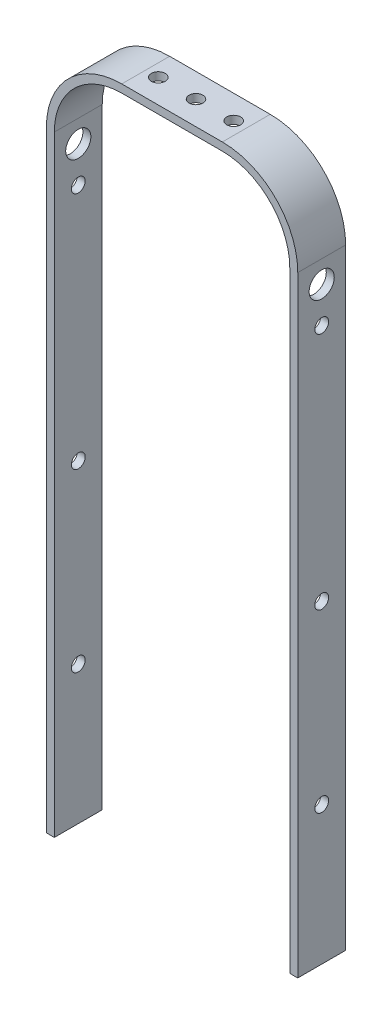
ISO-10303-21;
HEADER;
FILE_DESCRIPTION(('STEP AP214'),'2;1');
FILE_NAME('part.step','',(''),(''),'','','');
FILE_SCHEMA(('AUTOMOTIVE_DESIGN { 1 0 10303 214 1 1 1 1 }'));
ENDSEC;
DATA;
#1=APPLICATION_CONTEXT('core data for automotive mechanical design processes');
#2=APPLICATION_PROTOCOL_DEFINITION('international standard','automotive_design',2000,#1);
#3=PRODUCT_CONTEXT('',#1,'mechanical');
#4=PRODUCT('Part','Part','',(#3));
#5=PRODUCT_RELATED_PRODUCT_CATEGORY('part','',(#4));
#6=PRODUCT_DEFINITION_FORMATION('','',#4);
#7=PRODUCT_DEFINITION_CONTEXT('part definition',#1,'design');
#8=PRODUCT_DEFINITION('design','',#6,#7);
#9=PRODUCT_DEFINITION_SHAPE('','',#8);
#10=(LENGTH_UNIT() NAMED_UNIT(*) SI_UNIT(.MILLI.,.METRE.));
#11=(NAMED_UNIT(*) PLANE_ANGLE_UNIT() SI_UNIT($,.RADIAN.));
#12=(NAMED_UNIT(*) SI_UNIT($,.STERADIAN.) SOLID_ANGLE_UNIT());
#13=UNCERTAINTY_MEASURE_WITH_UNIT(LENGTH_MEASURE(1.E-05),#10,'distance_accuracy_value','');
#14=(GEOMETRIC_REPRESENTATION_CONTEXT(3) GLOBAL_UNCERTAINTY_ASSIGNED_CONTEXT((#13)) GLOBAL_UNIT_ASSIGNED_CONTEXT((#10,
#11,#12)) REPRESENTATION_CONTEXT('',''));
#15=CARTESIAN_POINT('',(0.,0.,0.));
#16=DIRECTION('',(0.,0.,1.));
#17=DIRECTION('',(1.,0.,0.));
#18=AXIS2_PLACEMENT_3D('',#15,#16,#17);
#19=CARTESIAN_POINT('',(46.825,0.,9.525));
#20=DIRECTION('',(0.,1.,0.));
#21=DIRECTION('',(-1.,0.,0.));
#22=AXIS2_PLACEMENT_3D('',#19,#20,#21);
#23=PLANE('',#22);
#24=DIRECTION('',(1.,0.,0.));
#25=VECTOR('',#24,1.);
#26=CARTESIAN_POINT('',(46.825,0.,-9.525));
#27=LINE('',#26,#25);
#28=CARTESIAN_POINT('',(46.825,0.,-9.525));
#29=VERTEX_POINT('',#28);
#30=CARTESIAN_POINT('',(50.,0.,-9.525));
#31=VERTEX_POINT('',#30);
#32=EDGE_CURVE('E157',#29,#31,#27,.T.);
#33=ORIENTED_EDGE('',*,*,#32,.T.);
#34=DIRECTION('',(0.,0.,-1.));
#35=VECTOR('',#34,1.);
#36=CARTESIAN_POINT('',(50.,0.,9.525));
#37=LINE('',#36,#35);
#38=CARTESIAN_POINT('',(50.,0.,9.525));
#39=VERTEX_POINT('',#38);
#40=EDGE_CURVE('E11',#39,#31,#37,.T.);
#41=ORIENTED_EDGE('',*,*,#40,.F.);
#42=DIRECTION('',(1.,0.,0.));
#43=VECTOR('',#42,1.);
#44=CARTESIAN_POINT('',(46.825,0.,9.525));
#45=LINE('',#44,#43);
#46=CARTESIAN_POINT('',(46.825,0.,9.525));
#47=VERTEX_POINT('',#46);
#48=EDGE_CURVE('E180',#47,#39,#45,.T.);
#49=ORIENTED_EDGE('',*,*,#48,.F.);
#50=DIRECTION('',(0.,0.,-1.));
#51=VECTOR('',#50,1.);
#52=CARTESIAN_POINT('',(46.825,0.,9.525));
#53=LINE('',#52,#51);
#54=EDGE_CURVE('E153',#47,#29,#53,.T.);
#55=ORIENTED_EDGE('',*,*,#54,.T.);
#56=EDGE_LOOP('',(#33,#41,#49,#55));
#57=FACE_BOUND('',#56,.T.);
#58=ADVANCED_FACE('F35',(#57),#23,.F.);
#59=CARTESIAN_POINT('',(50.,0.,9.525));
#60=DIRECTION('',(-1.,0.,0.));
#61=DIRECTION('',(0.,0.,1.));
#62=AXIS2_PLACEMENT_3D('',#59,#60,#61);
#63=PLANE('',#62);
#64=CARTESIAN_POINT('',(50.,234.175,0.));
#65=DIRECTION('',(1.,0.,0.));
#66=DIRECTION('',(0.,0.,-1.));
#67=AXIS2_PLACEMENT_3D('',#64,#65,#66);
#68=CIRCLE('',#67,5.);
#69=CARTESIAN_POINT('',(50.,234.175,-5.));
#70=VERTEX_POINT('',#69);
#71=EDGE_CURVE('E392',#70,#70,#68,.T.);
#72=ORIENTED_EDGE('',*,*,#71,.F.);
#73=EDGE_LOOP('',(#72));
#74=FACE_BOUND('',#73,.T.);
#75=CARTESIAN_POINT('',(50.,220.,0.));
#76=DIRECTION('',(-1.,0.,0.));
#77=DIRECTION('',(0.,0.,1.));
#78=AXIS2_PLACEMENT_3D('',#75,#76,#77);
#79=CIRCLE('',#78,2.75);
#80=CARTESIAN_POINT('',(50.,220.,-2.75));
#81=VERTEX_POINT('',#80);
#82=EDGE_CURVE('E229',#81,#81,#79,.T.);
#83=ORIENTED_EDGE('',*,*,#82,.T.);
#84=EDGE_LOOP('',(#83));
#85=FACE_BOUND('',#84,.T.);
#86=CARTESIAN_POINT('',(50.,125.,0.));
#87=DIRECTION('',(-1.,0.,0.));
#88=DIRECTION('',(0.,0.,1.));
#89=AXIS2_PLACEMENT_3D('',#86,#87,#88);
#90=CIRCLE('',#89,2.75);
#91=CARTESIAN_POINT('',(50.,125.,-2.75000000000002));
#92=VERTEX_POINT('',#91);
#93=EDGE_CURVE('E225',#92,#92,#90,.T.);
#94=ORIENTED_EDGE('',*,*,#93,.T.);
#95=EDGE_LOOP('',(#94));
#96=FACE_BOUND('',#95,.T.);
#97=CARTESIAN_POINT('',(50.,55.,0.));
#98=DIRECTION('',(-1.,0.,0.));
#99=DIRECTION('',(0.,0.,1.));
#100=AXIS2_PLACEMENT_3D('',#97,#98,#99);
#101=CIRCLE('',#100,2.75);
#102=CARTESIAN_POINT('',(50.,55.,-2.75000000000002));
#103=VERTEX_POINT('',#102);
#104=EDGE_CURVE('E221',#103,#103,#101,.T.);
#105=ORIENTED_EDGE('',*,*,#104,.T.);
#106=EDGE_LOOP('',(#105));
#107=FACE_BOUND('',#106,.T.);
#108=DIRECTION('',(0.,1.,0.));
#109=VECTOR('',#108,1.);
#110=CARTESIAN_POINT('',(50.,0.,-9.525));
#111=LINE('',#110,#109);
#112=CARTESIAN_POINT('',(50.,243.,-9.525));
#113=VERTEX_POINT('',#112);
#114=EDGE_CURVE('E160',#31,#113,#111,.T.);
#115=ORIENTED_EDGE('',*,*,#114,.T.);
#116=DIRECTION('',(0.,0.,-1.));
#117=VECTOR('',#116,1.);
#118=CARTESIAN_POINT('',(50.,243.,9.525));
#119=LINE('',#118,#117);
#120=CARTESIAN_POINT('',(50.,243.,9.525));
#121=VERTEX_POINT('',#120);
#122=EDGE_CURVE('E44',#121,#113,#119,.T.);
#123=ORIENTED_EDGE('',*,*,#122,.F.);
#124=DIRECTION('',(0.,1.,0.));
#125=VECTOR('',#124,1.);
#126=CARTESIAN_POINT('',(50.,0.,9.525));
#127=LINE('',#126,#125);
#128=EDGE_CURVE('E108',#39,#121,#127,.T.);
#129=ORIENTED_EDGE('',*,*,#128,.F.);
#130=ORIENTED_EDGE('',*,*,#40,.T.);
#131=EDGE_LOOP('',(#115,#123,#129,#130));
#132=FACE_BOUND('',#131,.T.);
#133=ADVANCED_FACE('F294',(#74,#85,#96,#107,#132),#63,.F.);
#134=CARTESIAN_POINT('',(20.,243.,9.525));
#135=DIRECTION('',(0.,0.,-1.));
#136=DIRECTION('',(-1.,0.,0.));
#137=AXIS2_PLACEMENT_3D('',#134,#135,#136);
#138=CYLINDRICAL_SURFACE('',#137,30.);
#139=CARTESIAN_POINT('',(20.,243.,-9.525));
#140=DIRECTION('',(0.,0.,1.));
#141=DIRECTION('',(1.,0.,0.));
#142=AXIS2_PLACEMENT_3D('',#139,#140,#141);
#143=CIRCLE('',#142,30.);
#144=CARTESIAN_POINT('',(20.,273.,-9.525));
#145=VERTEX_POINT('',#144);
#146=EDGE_CURVE('E163',#113,#145,#143,.T.);
#147=ORIENTED_EDGE('',*,*,#146,.T.);
#148=DIRECTION('',(0.,0.,-1.));
#149=VECTOR('',#148,1.);
#150=CARTESIAN_POINT('',(20.,273.,9.525));
#151=LINE('',#150,#149);
#152=CARTESIAN_POINT('',(20.,273.,9.525));
#153=VERTEX_POINT('',#152);
#154=EDGE_CURVE('E199',#153,#145,#151,.T.);
#155=ORIENTED_EDGE('',*,*,#154,.F.);
#156=CARTESIAN_POINT('',(20.,243.,9.525));
#157=DIRECTION('',(0.,0.,1.));
#158=DIRECTION('',(1.,0.,0.));
#159=AXIS2_PLACEMENT_3D('',#156,#157,#158);
#160=CIRCLE('',#159,30.);
#161=EDGE_CURVE('E251',#121,#153,#160,.T.);
#162=ORIENTED_EDGE('',*,*,#161,.F.);
#163=ORIENTED_EDGE('',*,*,#122,.T.);
#164=EDGE_LOOP('',(#147,#155,#162,#163));
#165=FACE_BOUND('',#164,.T.);
#166=ADVANCED_FACE('F299',(#165),#138,.T.);
#167=CARTESIAN_POINT('',(20.,273.,9.525));
#168=DIRECTION('',(0.,-1.,0.));
#169=DIRECTION('',(0.,0.,-1.));
#170=AXIS2_PLACEMENT_3D('',#167,#168,#169);
#171=PLANE('',#170);
#172=CARTESIAN_POINT('',(15.,273.,0.));
#173=DIRECTION('',(0.,1.,0.));
#174=DIRECTION('',(0.,0.,1.));
#175=AXIS2_PLACEMENT_3D('',#172,#173,#174);
#176=CIRCLE('',#175,2.75);
#177=CARTESIAN_POINT('',(15.,273.,2.75));
#178=VERTEX_POINT('',#177);
#179=EDGE_CURVE('E241',#178,#178,#176,.T.);
#180=ORIENTED_EDGE('',*,*,#179,.F.);
#181=EDGE_LOOP('',(#180));
#182=FACE_BOUND('',#181,.T.);
#183=CARTESIAN_POINT('',(-15.,273.,0.));
#184=DIRECTION('',(0.,1.,0.));
#185=DIRECTION('',(0.,0.,1.));
#186=AXIS2_PLACEMENT_3D('',#183,#184,#185);
#187=CIRCLE('',#186,2.75);
#188=CARTESIAN_POINT('',(-15.,273.,2.75));
#189=VERTEX_POINT('',#188);
#190=EDGE_CURVE('E242',#189,#189,#187,.T.);
#191=ORIENTED_EDGE('',*,*,#190,.F.);
#192=EDGE_LOOP('',(#191));
#193=FACE_BOUND('',#192,.T.);
#194=CARTESIAN_POINT('',(0.,273.,0.));
#195=DIRECTION('',(0.,1.,0.));
#196=DIRECTION('',(0.,0.,1.));
#197=AXIS2_PLACEMENT_3D('',#194,#195,#196);
#198=CIRCLE('',#197,2.75);
#199=CARTESIAN_POINT('',(0.,273.,2.75));
#200=VERTEX_POINT('',#199);
#201=EDGE_CURVE('E208',#200,#200,#198,.T.);
#202=ORIENTED_EDGE('',*,*,#201,.F.);
#203=EDGE_LOOP('',(#202));
#204=FACE_BOUND('',#203,.T.);
#205=DIRECTION('',(-1.,0.,0.));
#206=VECTOR('',#205,1.);
#207=CARTESIAN_POINT('',(20.,273.,-9.525));
#208=LINE('',#207,#206);
#209=CARTESIAN_POINT('',(-20.,273.,-9.525));
#210=VERTEX_POINT('',#209);
#211=EDGE_CURVE('E165',#145,#210,#208,.T.);
#212=ORIENTED_EDGE('',*,*,#211,.T.);
#213=DIRECTION('',(0.,0.,-1.));
#214=VECTOR('',#213,1.);
#215=CARTESIAN_POINT('',(-20.,273.,9.525));
#216=LINE('',#215,#214);
#217=CARTESIAN_POINT('',(-20.,273.,9.525));
#218=VERTEX_POINT('',#217);
#219=EDGE_CURVE('E196',#218,#210,#216,.T.);
#220=ORIENTED_EDGE('',*,*,#219,.F.);
#221=DIRECTION('',(-1.,0.,0.));
#222=VECTOR('',#221,1.);
#223=CARTESIAN_POINT('',(20.,273.,9.525));
#224=LINE('',#223,#222);
#225=EDGE_CURVE('E253',#153,#218,#224,.T.);
#226=ORIENTED_EDGE('',*,*,#225,.F.);
#227=ORIENTED_EDGE('',*,*,#154,.T.);
#228=EDGE_LOOP('',(#212,#220,#226,#227));
#229=FACE_BOUND('',#228,.T.);
#230=ADVANCED_FACE('F305',(#182,#193,#204,#229),#171,.F.);
#231=CARTESIAN_POINT('',(-20.,243.,9.525));
#232=DIRECTION('',(0.,0.,-1.));
#233=DIRECTION('',(-1.,0.,0.));
#234=AXIS2_PLACEMENT_3D('',#231,#232,#233);
#235=CYLINDRICAL_SURFACE('',#234,30.);
#236=CARTESIAN_POINT('',(-20.,243.,-9.525));
#237=DIRECTION('',(0.,0.,1.));
#238=DIRECTION('',(-1.,0.,0.));
#239=AXIS2_PLACEMENT_3D('',#236,#237,#238);
#240=CIRCLE('',#239,30.);
#241=CARTESIAN_POINT('',(-50.,243.,-9.525));
#242=VERTEX_POINT('',#241);
#243=EDGE_CURVE('E167',#210,#242,#240,.T.);
#244=ORIENTED_EDGE('',*,*,#243,.T.);
#245=DIRECTION('',(0.,0.,-1.));
#246=VECTOR('',#245,1.);
#247=CARTESIAN_POINT('',(-50.,243.,9.525));
#248=LINE('',#247,#246);
#249=CARTESIAN_POINT('',(-50.,243.,9.525));
#250=VERTEX_POINT('',#249);
#251=EDGE_CURVE('E193',#250,#242,#248,.T.);
#252=ORIENTED_EDGE('',*,*,#251,.F.);
#253=CARTESIAN_POINT('',(-20.,243.,9.525));
#254=DIRECTION('',(0.,0.,1.));
#255=DIRECTION('',(-1.,0.,0.));
#256=AXIS2_PLACEMENT_3D('',#253,#254,#255);
#257=CIRCLE('',#256,30.);
#258=EDGE_CURVE('E255',#218,#250,#257,.T.);
#259=ORIENTED_EDGE('',*,*,#258,.F.);
#260=ORIENTED_EDGE('',*,*,#219,.T.);
#261=EDGE_LOOP('',(#244,#252,#259,#260));
#262=FACE_BOUND('',#261,.T.);
#263=ADVANCED_FACE('F313',(#262),#235,.T.);
#264=CARTESIAN_POINT('',(-50.,0.,9.525));
#265=DIRECTION('',(1.,0.,0.));
#266=DIRECTION('',(0.,0.,-1.));
#267=AXIS2_PLACEMENT_3D('',#264,#265,#266);
#268=PLANE('',#267);
#269=CARTESIAN_POINT('',(-50.,234.175,0.));
#270=DIRECTION('',(1.,0.,0.));
#271=DIRECTION('',(0.,0.,-1.));
#272=AXIS2_PLACEMENT_3D('',#269,#270,#271);
#273=CIRCLE('',#272,5.);
#274=CARTESIAN_POINT('',(-50.,234.175,-5.));
#275=VERTEX_POINT('',#274);
#276=EDGE_CURVE('E381',#275,#275,#273,.T.);
#277=ORIENTED_EDGE('',*,*,#276,.T.);
#278=EDGE_LOOP('',(#277));
#279=FACE_BOUND('',#278,.T.);
#280=CARTESIAN_POINT('',(-50.,220.,0.));
#281=DIRECTION('',(1.,0.,0.));
#282=DIRECTION('',(0.,0.,-1.));
#283=AXIS2_PLACEMENT_3D('',#280,#281,#282);
#284=CIRCLE('',#283,2.75);
#285=CARTESIAN_POINT('',(-50.,220.,-2.75));
#286=VERTEX_POINT('',#285);
#287=EDGE_CURVE('E217',#286,#286,#284,.T.);
#288=ORIENTED_EDGE('',*,*,#287,.T.);
#289=EDGE_LOOP('',(#288));
#290=FACE_BOUND('',#289,.T.);
#291=CARTESIAN_POINT('',(-50.,125.,0.));
#292=DIRECTION('',(1.,0.,0.));
#293=DIRECTION('',(0.,0.,-1.));
#294=AXIS2_PLACEMENT_3D('',#291,#292,#293);
#295=CIRCLE('',#294,2.75);
#296=CARTESIAN_POINT('',(-50.,125.,-2.75000000000002));
#297=VERTEX_POINT('',#296);
#298=EDGE_CURVE('E388',#297,#297,#295,.T.);
#299=ORIENTED_EDGE('',*,*,#298,.T.);
#300=EDGE_LOOP('',(#299));
#301=FACE_BOUND('',#300,.T.);
#302=CARTESIAN_POINT('',(-50.,55.,0.));
#303=DIRECTION('',(1.,0.,0.));
#304=DIRECTION('',(0.,0.,-1.));
#305=AXIS2_PLACEMENT_3D('',#302,#303,#304);
#306=CIRCLE('',#305,2.75);
#307=CARTESIAN_POINT('',(-50.,55.,-2.75000000000002));
#308=VERTEX_POINT('',#307);
#309=EDGE_CURVE('E385',#308,#308,#306,.T.);
#310=ORIENTED_EDGE('',*,*,#309,.T.);
#311=EDGE_LOOP('',(#310));
#312=FACE_BOUND('',#311,.T.);
#313=DIRECTION('',(0.,-1.,0.));
#314=VECTOR('',#313,1.);
#315=CARTESIAN_POINT('',(-50.,0.,-9.525));
#316=LINE('',#315,#314);
#317=CARTESIAN_POINT('',(-50.,0.,-9.525));
#318=VERTEX_POINT('',#317);
#319=EDGE_CURVE('E169',#242,#318,#316,.T.);
#320=ORIENTED_EDGE('',*,*,#319,.T.);
#321=DIRECTION('',(0.,0.,-1.));
#322=VECTOR('',#321,1.);
#323=CARTESIAN_POINT('',(-50.,0.,9.525));
#324=LINE('',#323,#322);
#325=CARTESIAN_POINT('',(-50.,0.,9.525));
#326=VERTEX_POINT('',#325);
#327=EDGE_CURVE('E190',#326,#318,#324,.T.);
#328=ORIENTED_EDGE('',*,*,#327,.F.);
#329=DIRECTION('',(0.,-1.,0.));
#330=VECTOR('',#329,1.);
#331=CARTESIAN_POINT('',(-50.,0.,9.525));
#332=LINE('',#331,#330);
#333=EDGE_CURVE('E257',#250,#326,#332,.T.);
#334=ORIENTED_EDGE('',*,*,#333,.F.);
#335=ORIENTED_EDGE('',*,*,#251,.T.);
#336=EDGE_LOOP('',(#320,#328,#334,#335));
#337=FACE_BOUND('',#336,.T.);
#338=ADVANCED_FACE('F317',(#279,#290,#301,#312,#337),#268,.F.);
#339=CARTESIAN_POINT('',(-46.825,0.,9.525));
#340=DIRECTION('',(0.,1.,0.));
#341=DIRECTION('',(-1.,0.,0.));
#342=AXIS2_PLACEMENT_3D('',#339,#340,#341);
#343=PLANE('',#342);
#344=DIRECTION('',(1.,0.,0.));
#345=VECTOR('',#344,1.);
#346=CARTESIAN_POINT('',(-46.825,0.,-9.525));
#347=LINE('',#346,#345);
#348=CARTESIAN_POINT('',(-46.825,0.,-9.525));
#349=VERTEX_POINT('',#348);
#350=EDGE_CURVE('E171',#318,#349,#347,.T.);
#351=ORIENTED_EDGE('',*,*,#350,.T.);
#352=DIRECTION('',(0.,0.,-1.));
#353=VECTOR('',#352,1.);
#354=CARTESIAN_POINT('',(-46.825,0.,9.525));
#355=LINE('',#354,#353);
#356=CARTESIAN_POINT('',(-46.825,0.,9.525));
#357=VERTEX_POINT('',#356);
#358=EDGE_CURVE('E187',#357,#349,#355,.T.);
#359=ORIENTED_EDGE('',*,*,#358,.F.);
#360=DIRECTION('',(1.,0.,0.));
#361=VECTOR('',#360,1.);
#362=CARTESIAN_POINT('',(-46.825,0.,9.525));
#363=LINE('',#362,#361);
#364=EDGE_CURVE('E259',#326,#357,#363,.T.);
#365=ORIENTED_EDGE('',*,*,#364,.F.);
#366=ORIENTED_EDGE('',*,*,#327,.T.);
#367=EDGE_LOOP('',(#351,#359,#365,#366));
#368=FACE_BOUND('',#367,.T.);
#369=ADVANCED_FACE('F320',(#368),#343,.F.);
#370=CARTESIAN_POINT('',(-46.825,243.,9.525));
#371=DIRECTION('',(-1.,0.,0.));
#372=DIRECTION('',(0.,-1.,0.));
#373=AXIS2_PLACEMENT_3D('',#370,#371,#372);
#374=PLANE('',#373);
#375=CARTESIAN_POINT('',(-46.825,234.175,0.));
#376=DIRECTION('',(-1.,0.,0.));
#377=DIRECTION('',(0.,-1.,0.));
#378=AXIS2_PLACEMENT_3D('',#375,#376,#377);
#379=CIRCLE('',#378,5.);
#380=CARTESIAN_POINT('',(-46.825,229.175,0.));
#381=VERTEX_POINT('',#380);
#382=EDGE_CURVE('E384',#381,#381,#379,.T.);
#383=ORIENTED_EDGE('',*,*,#382,.T.);
#384=EDGE_LOOP('',(#383));
#385=FACE_BOUND('',#384,.T.);
#386=CARTESIAN_POINT('',(-46.825,220.,0.));
#387=DIRECTION('',(-1.,0.,0.));
#388=DIRECTION('',(0.,-1.,0.));
#389=AXIS2_PLACEMENT_3D('',#386,#387,#388);
#390=CIRCLE('',#389,2.75);
#391=CARTESIAN_POINT('',(-46.825,217.25,0.));
#392=VERTEX_POINT('',#391);
#393=EDGE_CURVE('E224',#392,#392,#390,.T.);
#394=ORIENTED_EDGE('',*,*,#393,.T.);
#395=EDGE_LOOP('',(#394));
#396=FACE_BOUND('',#395,.T.);
#397=CARTESIAN_POINT('',(-46.825,125.,0.));
#398=DIRECTION('',(-1.,0.,0.));
#399=DIRECTION('',(0.,-1.,0.));
#400=AXIS2_PLACEMENT_3D('',#397,#398,#399);
#401=CIRCLE('',#400,2.75);
#402=CARTESIAN_POINT('',(-46.825,122.25,0.));
#403=VERTEX_POINT('',#402);
#404=EDGE_CURVE('E220',#403,#403,#401,.T.);
#405=ORIENTED_EDGE('',*,*,#404,.T.);
#406=EDGE_LOOP('',(#405));
#407=FACE_BOUND('',#406,.T.);
#408=CARTESIAN_POINT('',(-46.825,55.,0.));
#409=DIRECTION('',(-1.,0.,0.));
#410=DIRECTION('',(0.,-1.,0.));
#411=AXIS2_PLACEMENT_3D('',#408,#409,#410);
#412=CIRCLE('',#411,2.75);
#413=CARTESIAN_POINT('',(-46.825,52.25,0.));
#414=VERTEX_POINT('',#413);
#415=EDGE_CURVE('E216',#414,#414,#412,.T.);
#416=ORIENTED_EDGE('',*,*,#415,.T.);
#417=EDGE_LOOP('',(#416));
#418=FACE_BOUND('',#417,.T.);
#419=DIRECTION('',(0.,1.,0.));
#420=VECTOR('',#419,1.);
#421=CARTESIAN_POINT('',(-46.825,243.,-9.525));
#422=LINE('',#421,#420);
#423=CARTESIAN_POINT('',(-46.825,243.,-9.525));
#424=VERTEX_POINT('',#423);
#425=EDGE_CURVE('E173',#349,#424,#422,.T.);
#426=ORIENTED_EDGE('',*,*,#425,.T.);
#427=DIRECTION('',(0.,0.,-1.));
#428=VECTOR('',#427,1.);
#429=CARTESIAN_POINT('',(-46.825,243.,9.525));
#430=LINE('',#429,#428);
#431=CARTESIAN_POINT('',(-46.825,243.,9.525));
#432=VERTEX_POINT('',#431);
#433=EDGE_CURVE('E184',#432,#424,#430,.T.);
#434=ORIENTED_EDGE('',*,*,#433,.F.);
#435=DIRECTION('',(0.,1.,0.));
#436=VECTOR('',#435,1.);
#437=CARTESIAN_POINT('',(-46.825,243.,9.525));
#438=LINE('',#437,#436);
#439=EDGE_CURVE('E261',#357,#432,#438,.T.);
#440=ORIENTED_EDGE('',*,*,#439,.F.);
#441=ORIENTED_EDGE('',*,*,#358,.T.);
#442=EDGE_LOOP('',(#426,#434,#440,#441));
#443=FACE_BOUND('',#442,.T.);
#444=ADVANCED_FACE('F267',(#385,#396,#407,#418,#443),#374,.F.);
#445=CARTESIAN_POINT('',(-20.,243.,9.525));
#446=DIRECTION('',(0.,0.,-1.));
#447=DIRECTION('',(-1.,0.,0.));
#448=AXIS2_PLACEMENT_3D('',#445,#446,#447);
#449=CYLINDRICAL_SURFACE('',#448,26.825);
#450=CARTESIAN_POINT('',(-20.,243.,-9.525));
#451=DIRECTION('',(0.,0.,-1.));
#452=DIRECTION('',(1.,0.,0.));
#453=AXIS2_PLACEMENT_3D('',#450,#451,#452);
#454=CIRCLE('',#453,26.825);
#455=CARTESIAN_POINT('',(-20.,269.825,-9.525));
#456=VERTEX_POINT('',#455);
#457=EDGE_CURVE('E175',#424,#456,#454,.T.);
#458=ORIENTED_EDGE('',*,*,#457,.T.);
#459=DIRECTION('',(0.,0.,-1.));
#460=VECTOR('',#459,1.);
#461=CARTESIAN_POINT('',(-20.,269.825,9.525));
#462=LINE('',#461,#460);
#463=CARTESIAN_POINT('',(-20.,269.825,9.525));
#464=VERTEX_POINT('',#463);
#465=EDGE_CURVE('E148',#464,#456,#462,.T.);
#466=ORIENTED_EDGE('',*,*,#465,.F.);
#467=CARTESIAN_POINT('',(-20.,243.,9.525));
#468=DIRECTION('',(0.,0.,-1.));
#469=DIRECTION('',(1.,0.,0.));
#470=AXIS2_PLACEMENT_3D('',#467,#468,#469);
#471=CIRCLE('',#470,26.825);
#472=EDGE_CURVE('E139',#432,#464,#471,.T.);
#473=ORIENTED_EDGE('',*,*,#472,.F.);
#474=ORIENTED_EDGE('',*,*,#433,.T.);
#475=EDGE_LOOP('',(#458,#466,#473,#474));
#476=FACE_BOUND('',#475,.T.);
#477=ADVANCED_FACE('F271',(#476),#449,.F.);
#478=CARTESIAN_POINT('',(-20.,269.825,9.525));
#479=DIRECTION('',(0.,1.,0.));
#480=DIRECTION('',(0.,0.,1.));
#481=AXIS2_PLACEMENT_3D('',#478,#479,#480);
#482=PLANE('',#481);
#483=CARTESIAN_POINT('',(15.,269.825,0.));
#484=DIRECTION('',(0.,1.,0.));
#485=DIRECTION('',(0.,0.,1.));
#486=AXIS2_PLACEMENT_3D('',#483,#484,#485);
#487=CIRCLE('',#486,2.75);
#488=CARTESIAN_POINT('',(15.,269.825,2.75));
#489=VERTEX_POINT('',#488);
#490=EDGE_CURVE('E161',#489,#489,#487,.T.);
#491=ORIENTED_EDGE('',*,*,#490,.T.);
#492=EDGE_LOOP('',(#491));
#493=FACE_BOUND('',#492,.T.);
#494=CARTESIAN_POINT('',(-15.,269.825,0.));
#495=DIRECTION('',(0.,1.,0.));
#496=DIRECTION('',(0.,0.,1.));
#497=AXIS2_PLACEMENT_3D('',#494,#495,#496);
#498=CIRCLE('',#497,2.75);
#499=CARTESIAN_POINT('',(-15.,269.825,2.75));
#500=VERTEX_POINT('',#499);
#501=EDGE_CURVE('E207',#500,#500,#498,.T.);
#502=ORIENTED_EDGE('',*,*,#501,.T.);
#503=EDGE_LOOP('',(#502));
#504=FACE_BOUND('',#503,.T.);
#505=CARTESIAN_POINT('',(0.,269.825,0.));
#506=DIRECTION('',(0.,1.,0.));
#507=DIRECTION('',(0.,0.,1.));
#508=AXIS2_PLACEMENT_3D('',#505,#506,#507);
#509=CIRCLE('',#508,2.75);
#510=CARTESIAN_POINT('',(0.,269.825,2.75));
#511=VERTEX_POINT('',#510);
#512=EDGE_CURVE('E204',#511,#511,#509,.T.);
#513=ORIENTED_EDGE('',*,*,#512,.T.);
#514=EDGE_LOOP('',(#513));
#515=FACE_BOUND('',#514,.T.);
#516=DIRECTION('',(1.,0.,0.));
#517=VECTOR('',#516,1.);
#518=CARTESIAN_POINT('',(-20.,269.825,-9.525));
#519=LINE('',#518,#517);
#520=CARTESIAN_POINT('',(20.,269.825,-9.525));
#521=VERTEX_POINT('',#520);
#522=EDGE_CURVE('E147',#456,#521,#519,.T.);
#523=ORIENTED_EDGE('',*,*,#522,.T.);
#524=DIRECTION('',(0.,0.,-1.));
#525=VECTOR('',#524,1.);
#526=CARTESIAN_POINT('',(20.,269.825,9.525));
#527=LINE('',#526,#525);
#528=CARTESIAN_POINT('',(20.,269.825,9.525));
#529=VERTEX_POINT('',#528);
#530=EDGE_CURVE('E144',#529,#521,#527,.T.);
#531=ORIENTED_EDGE('',*,*,#530,.F.);
#532=DIRECTION('',(1.,0.,0.));
#533=VECTOR('',#532,1.);
#534=CARTESIAN_POINT('',(-20.,269.825,9.525));
#535=LINE('',#534,#533);
#536=EDGE_CURVE('E133',#464,#529,#535,.T.);
#537=ORIENTED_EDGE('',*,*,#536,.F.);
#538=ORIENTED_EDGE('',*,*,#465,.T.);
#539=EDGE_LOOP('',(#523,#531,#537,#538));
#540=FACE_BOUND('',#539,.T.);
#541=ADVANCED_FACE('F145',(#493,#504,#515,#540),#482,.F.);
#542=CARTESIAN_POINT('',(20.,243.,9.525));
#543=DIRECTION('',(0.,0.,-1.));
#544=DIRECTION('',(-1.,0.,0.));
#545=AXIS2_PLACEMENT_3D('',#542,#543,#544);
#546=CYLINDRICAL_SURFACE('',#545,26.825);
#547=CARTESIAN_POINT('',(20.,243.,-9.525));
#548=DIRECTION('',(0.,0.,-1.));
#549=DIRECTION('',(-1.,0.,0.));
#550=AXIS2_PLACEMENT_3D('',#547,#548,#549);
#551=CIRCLE('',#550,26.825);
#552=CARTESIAN_POINT('',(46.825,243.,-9.525));
#553=VERTEX_POINT('',#552);
#554=EDGE_CURVE('E94',#521,#553,#551,.T.);
#555=ORIENTED_EDGE('',*,*,#554,.T.);
#556=DIRECTION('',(0.,0.,-1.));
#557=VECTOR('',#556,1.);
#558=CARTESIAN_POINT('',(46.825,243.,9.525));
#559=LINE('',#558,#557);
#560=CARTESIAN_POINT('',(46.825,243.,9.525));
#561=VERTEX_POINT('',#560);
#562=EDGE_CURVE('E149',#561,#553,#559,.T.);
#563=ORIENTED_EDGE('',*,*,#562,.F.);
#564=CARTESIAN_POINT('',(20.,243.,9.525));
#565=DIRECTION('',(0.,0.,-1.));
#566=DIRECTION('',(-1.,0.,0.));
#567=AXIS2_PLACEMENT_3D('',#564,#565,#566);
#568=CIRCLE('',#567,26.825);
#569=EDGE_CURVE('E137',#529,#561,#568,.T.);
#570=ORIENTED_EDGE('',*,*,#569,.F.);
#571=ORIENTED_EDGE('',*,*,#530,.T.);
#572=EDGE_LOOP('',(#555,#563,#570,#571));
#573=FACE_BOUND('',#572,.T.);
#574=ADVANCED_FACE('F151',(#573),#546,.F.);
#575=CARTESIAN_POINT('',(46.825,243.,9.525));
#576=DIRECTION('',(1.,0.,0.));
#577=DIRECTION('',(0.,1.,0.));
#578=AXIS2_PLACEMENT_3D('',#575,#576,#577);
#579=PLANE('',#578);
#580=CARTESIAN_POINT('',(46.825,234.175,0.));
#581=DIRECTION('',(1.,0.,0.));
#582=DIRECTION('',(0.,1.,0.));
#583=AXIS2_PLACEMENT_3D('',#580,#581,#582);
#584=CIRCLE('',#583,5.);
#585=CARTESIAN_POINT('',(46.825,239.175,0.));
#586=VERTEX_POINT('',#585);
#587=EDGE_CURVE('E38',#586,#586,#584,.T.);
#588=ORIENTED_EDGE('',*,*,#587,.T.);
#589=EDGE_LOOP('',(#588));
#590=FACE_BOUND('',#589,.T.);
#591=CARTESIAN_POINT('',(46.825,220.,0.));
#592=DIRECTION('',(1.,0.,0.));
#593=DIRECTION('',(0.,1.,0.));
#594=AXIS2_PLACEMENT_3D('',#591,#592,#593);
#595=CIRCLE('',#594,2.75);
#596=CARTESIAN_POINT('',(46.825,220.,-2.75));
#597=VERTEX_POINT('',#596);
#598=EDGE_CURVE('E222',#597,#597,#595,.T.);
#599=ORIENTED_EDGE('',*,*,#598,.T.);
#600=EDGE_LOOP('',(#599));
#601=FACE_BOUND('',#600,.T.);
#602=CARTESIAN_POINT('',(46.825,125.,0.));
#603=DIRECTION('',(1.,0.,0.));
#604=DIRECTION('',(0.,1.,0.));
#605=AXIS2_PLACEMENT_3D('',#602,#603,#604);
#606=CIRCLE('',#605,2.75);
#607=CARTESIAN_POINT('',(46.825,125.,-2.75000000000002));
#608=VERTEX_POINT('',#607);
#609=EDGE_CURVE('E218',#608,#608,#606,.T.);
#610=ORIENTED_EDGE('',*,*,#609,.T.);
#611=EDGE_LOOP('',(#610));
#612=FACE_BOUND('',#611,.T.);
#613=CARTESIAN_POINT('',(46.825,55.,0.));
#614=DIRECTION('',(1.,0.,0.));
#615=DIRECTION('',(0.,1.,0.));
#616=AXIS2_PLACEMENT_3D('',#613,#614,#615);
#617=CIRCLE('',#616,2.75);
#618=CARTESIAN_POINT('',(46.825,55.,-2.75000000000002));
#619=VERTEX_POINT('',#618);
#620=EDGE_CURVE('E213',#619,#619,#617,.T.);
#621=ORIENTED_EDGE('',*,*,#620,.T.);
#622=EDGE_LOOP('',(#621));
#623=FACE_BOUND('',#622,.T.);
#624=DIRECTION('',(0.,-1.,0.));
#625=VECTOR('',#624,1.);
#626=CARTESIAN_POINT('',(46.825,243.,-9.525));
#627=LINE('',#626,#625);
#628=EDGE_CURVE('E100',#553,#29,#627,.T.);
#629=ORIENTED_EDGE('',*,*,#628,.T.);
#630=ORIENTED_EDGE('',*,*,#54,.F.);
#631=DIRECTION('',(0.,-1.,0.));
#632=VECTOR('',#631,1.);
#633=CARTESIAN_POINT('',(46.825,243.,9.525));
#634=LINE('',#633,#632);
#635=EDGE_CURVE('E53',#561,#47,#634,.T.);
#636=ORIENTED_EDGE('',*,*,#635,.F.);
#637=ORIENTED_EDGE('',*,*,#562,.T.);
#638=EDGE_LOOP('',(#629,#630,#636,#637));
#639=FACE_BOUND('',#638,.T.);
#640=ADVANCED_FACE('F279',(#590,#601,#612,#623,#639),#579,.F.);
#641=CARTESIAN_POINT('',(20.,243.,9.525));
#642=DIRECTION('',(0.,0.,1.));
#643=DIRECTION('',(1.,0.,0.));
#644=AXIS2_PLACEMENT_3D('',#641,#642,#643);
#645=PLANE('',#644);
#646=ORIENTED_EDGE('',*,*,#48,.T.);
#647=ORIENTED_EDGE('',*,*,#128,.T.);
#648=ORIENTED_EDGE('',*,*,#161,.T.);
#649=ORIENTED_EDGE('',*,*,#225,.T.);
#650=ORIENTED_EDGE('',*,*,#258,.T.);
#651=ORIENTED_EDGE('',*,*,#333,.T.);
#652=ORIENTED_EDGE('',*,*,#364,.T.);
#653=ORIENTED_EDGE('',*,*,#439,.T.);
#654=ORIENTED_EDGE('',*,*,#472,.T.);
#655=ORIENTED_EDGE('',*,*,#536,.T.);
#656=ORIENTED_EDGE('',*,*,#569,.T.);
#657=ORIENTED_EDGE('',*,*,#635,.T.);
#658=EDGE_LOOP('',(#646,#647,#648,#649,#650,#651,#652,#653,#654,#655,#656,#657));
#659=FACE_BOUND('',#658,.T.);
#660=ADVANCED_FACE('F135',(#659),#645,.T.);
#661=CARTESIAN_POINT('',(20.,243.,-9.525));
#662=DIRECTION('',(0.,0.,1.));
#663=DIRECTION('',(1.,0.,0.));
#664=AXIS2_PLACEMENT_3D('',#661,#662,#663);
#665=PLANE('',#664);
#666=ORIENTED_EDGE('',*,*,#32,.F.);
#667=ORIENTED_EDGE('',*,*,#628,.F.);
#668=ORIENTED_EDGE('',*,*,#554,.F.);
#669=ORIENTED_EDGE('',*,*,#522,.F.);
#670=ORIENTED_EDGE('',*,*,#457,.F.);
#671=ORIENTED_EDGE('',*,*,#425,.F.);
#672=ORIENTED_EDGE('',*,*,#350,.F.);
#673=ORIENTED_EDGE('',*,*,#319,.F.);
#674=ORIENTED_EDGE('',*,*,#243,.F.);
#675=ORIENTED_EDGE('',*,*,#211,.F.);
#676=ORIENTED_EDGE('',*,*,#146,.F.);
#677=ORIENTED_EDGE('',*,*,#114,.F.);
#678=EDGE_LOOP('',(#666,#667,#668,#669,#670,#671,#672,#673,#674,#675,#676,#677));
#679=FACE_BOUND('',#678,.T.);
#680=ADVANCED_FACE('F274',(#679),#665,.F.);
#681=CARTESIAN_POINT('',(0.,0.,0.));
#682=DIRECTION('',(0.,1.,0.));
#683=DIRECTION('',(0.,0.,1.));
#684=AXIS2_PLACEMENT_3D('',#681,#682,#683);
#685=CYLINDRICAL_SURFACE('',#684,2.75);
#686=ORIENTED_EDGE('',*,*,#201,.T.);
#687=EDGE_LOOP('',(#686));
#688=FACE_BOUND('',#687,.T.);
#689=ORIENTED_EDGE('',*,*,#512,.F.);
#690=EDGE_LOOP('',(#689));
#691=FACE_BOUND('',#690,.T.);
#692=ADVANCED_FACE('F339',(#688,#691),#685,.F.);
#693=CARTESIAN_POINT('',(-15.,0.,0.));
#694=DIRECTION('',(0.,1.,0.));
#695=DIRECTION('',(0.,0.,1.));
#696=AXIS2_PLACEMENT_3D('',#693,#694,#695);
#697=CYLINDRICAL_SURFACE('',#696,2.75);
#698=ORIENTED_EDGE('',*,*,#190,.T.);
#699=EDGE_LOOP('',(#698));
#700=FACE_BOUND('',#699,.T.);
#701=ORIENTED_EDGE('',*,*,#501,.F.);
#702=EDGE_LOOP('',(#701));
#703=FACE_BOUND('',#702,.T.);
#704=ADVANCED_FACE('F341',(#700,#703),#697,.F.);
#705=CARTESIAN_POINT('',(15.,0.,0.));
#706=DIRECTION('',(0.,1.,0.));
#707=DIRECTION('',(0.,0.,1.));
#708=AXIS2_PLACEMENT_3D('',#705,#706,#707);
#709=CYLINDRICAL_SURFACE('',#708,2.75);
#710=ORIENTED_EDGE('',*,*,#179,.T.);
#711=EDGE_LOOP('',(#710));
#712=FACE_BOUND('',#711,.T.);
#713=ORIENTED_EDGE('',*,*,#490,.F.);
#714=EDGE_LOOP('',(#713));
#715=FACE_BOUND('',#714,.T.);
#716=ADVANCED_FACE('F348',(#712,#715),#709,.F.);
#717=CARTESIAN_POINT('',(-50.,55.,0.));
#718=DIRECTION('',(1.,0.,0.));
#719=DIRECTION('',(0.,0.,-1.));
#720=AXIS2_PLACEMENT_3D('',#717,#718,#719);
#721=CYLINDRICAL_SURFACE('',#720,2.75);
#722=CARTESIAN_POINT('',(46.825,55.,-2.75000000000002));
#723=CARTESIAN_POINT('',(46.8580729166667,55.,-2.75000000000002));
#724=CARTESIAN_POINT('',(46.8911458333334,55.,-2.75000000000002));
#725=CARTESIAN_POINT('',(46.9572916666667,55.,-2.75000000000002));
#726=CARTESIAN_POINT('',(46.9903645833334,55.,-2.75000000000002));
#727=CARTESIAN_POINT('',(47.0565104166667,55.,-2.75000000000002));
#728=CARTESIAN_POINT('',(47.0895833333334,55.,-2.75000000000002));
#729=CARTESIAN_POINT('',(47.1557291666667,55.,-2.75000000000002));
#730=CARTESIAN_POINT('',(47.1888020833333,55.,-2.75000000000002));
#731=CARTESIAN_POINT('',(47.2549479166667,55.,-2.75000000000002));
#732=CARTESIAN_POINT('',(47.2880208333333,55.,-2.75000000000002));
#733=CARTESIAN_POINT('',(47.3541666666667,55.,-2.75000000000002));
#734=CARTESIAN_POINT('',(47.3872395833334,55.,-2.75000000000002));
#735=CARTESIAN_POINT('',(47.4533854166667,55.,-2.75000000000002));
#736=CARTESIAN_POINT('',(47.4864583333334,55.,-2.75000000000002));
#737=CARTESIAN_POINT('',(47.5526041666667,55.,-2.75000000000002));
#738=CARTESIAN_POINT('',(47.5856770833333,55.,-2.75000000000002));
#739=CARTESIAN_POINT('',(47.6518229166667,55.,-2.75000000000002));
#740=CARTESIAN_POINT('',(47.6848958333333,55.,-2.75000000000002));
#741=CARTESIAN_POINT('',(47.7510416666667,55.,-2.75000000000002));
#742=CARTESIAN_POINT('',(47.7841145833333,55.,-2.75000000000002));
#743=CARTESIAN_POINT('',(47.8502604166667,55.,-2.75000000000002));
#744=CARTESIAN_POINT('',(47.8833333333333,55.,-2.75000000000002));
#745=CARTESIAN_POINT('',(47.9494791666667,55.,-2.75000000000002));
#746=CARTESIAN_POINT('',(47.9825520833334,55.,-2.75000000000002));
#747=CARTESIAN_POINT('',(48.0486979166667,55.,-2.75000000000002));
#748=CARTESIAN_POINT('',(48.0817708333334,55.,-2.75000000000002));
#749=CARTESIAN_POINT('',(48.1479166666667,55.,-2.75000000000002));
#750=CARTESIAN_POINT('',(48.1809895833333,55.,-2.75000000000002));
#751=CARTESIAN_POINT('',(48.2471354166667,55.,-2.75000000000002));
#752=CARTESIAN_POINT('',(48.2802083333333,55.,-2.75000000000002));
#753=CARTESIAN_POINT('',(48.3463541666667,55.,-2.75000000000002));
#754=CARTESIAN_POINT('',(48.3794270833333,55.,-2.75000000000002));
#755=CARTESIAN_POINT('',(48.4455729166667,55.,-2.75000000000002));
#756=CARTESIAN_POINT('',(48.4786458333333,55.,-2.75000000000002));
#757=CARTESIAN_POINT('',(48.5447916666667,55.,-2.75000000000002));
#758=CARTESIAN_POINT('',(48.5778645833333,55.,-2.75000000000002));
#759=CARTESIAN_POINT('',(48.6440104166667,55.,-2.75000000000002));
#760=CARTESIAN_POINT('',(48.6770833333333,55.,-2.75000000000002));
#761=CARTESIAN_POINT('',(48.7432291666667,55.,-2.75000000000002));
#762=CARTESIAN_POINT('',(48.7763020833333,55.,-2.75000000000002));
#763=CARTESIAN_POINT('',(48.8424479166667,55.,-2.75000000000002));
#764=CARTESIAN_POINT('',(48.8755208333333,55.,-2.75000000000002));
#765=CARTESIAN_POINT('',(48.9416666666667,55.,-2.75000000000002));
#766=CARTESIAN_POINT('',(48.9747395833333,55.,-2.75000000000002));
#767=CARTESIAN_POINT('',(49.0408854166667,55.,-2.75000000000002));
#768=CARTESIAN_POINT('',(49.0739583333333,55.,-2.75000000000002));
#769=CARTESIAN_POINT('',(49.1401041666667,55.,-2.75000000000002));
#770=CARTESIAN_POINT('',(49.1731770833333,55.,-2.75000000000002));
#771=CARTESIAN_POINT('',(49.2393229166667,55.,-2.75000000000002));
#772=CARTESIAN_POINT('',(49.2723958333333,55.,-2.75000000000002));
#773=CARTESIAN_POINT('',(49.3385416666667,55.,-2.75000000000002));
#774=CARTESIAN_POINT('',(49.3716145833333,55.,-2.75000000000002));
#775=CARTESIAN_POINT('',(49.4377604166667,55.,-2.75000000000002));
#776=CARTESIAN_POINT('',(49.4708333333333,55.,-2.75000000000002));
#777=CARTESIAN_POINT('',(49.5369791666667,55.,-2.75000000000002));
#778=CARTESIAN_POINT('',(49.5700520833333,55.,-2.75000000000002));
#779=CARTESIAN_POINT('',(49.6361979166667,55.,-2.75000000000002));
#780=CARTESIAN_POINT('',(49.6692708333333,55.,-2.75000000000002));
#781=CARTESIAN_POINT('',(49.7354166666667,55.,-2.75000000000002));
#782=CARTESIAN_POINT('',(49.7684895833333,55.,-2.75000000000002));
#783=CARTESIAN_POINT('',(49.8346354166667,55.,-2.75000000000002));
#784=CARTESIAN_POINT('',(49.8677083333333,55.,-2.75000000000002));
#785=CARTESIAN_POINT('',(49.9338541666667,55.,-2.75000000000002));
#786=CARTESIAN_POINT('',(49.9669270833333,55.,-2.75000000000002));
#787=CARTESIAN_POINT('',(50.,55.,-2.75000000000002));
#788=B_SPLINE_CURVE_WITH_KNOTS('',3,(#722,#723,#724,#725,#726,#727,#728,#729,#730,#731,#732,
#733,#734,#735,#736,#737,#738,#739,#740,#741,#742,#743,#744,#745,#746,#747,#748,#749,#750,#751,
#752,#753,#754,#755,#756,#757,#758,#759,#760,#761,#762,#763,#764,#765,#766,#767,#768,#769,#770,
#771,#772,#773,#774,#775,#776,#777,#778,#779,#780,#781,#782,#783,#784,#785,#786,#787),
.UNSPECIFIED.,.F.,.F.,(4,2,2,2,2,2,2,2,2,2,2,2,2,2,2,2,2,2,2,2,2,2,2,2,2,2,2,2,2,2,2,2,4),(0.,
0.0992187500000047,0.198437499999995,0.29765625,0.396874999999991,0.496093749999996,0.5953125,
0.694531249999991,0.793749999999996,0.892968750000001,0.992187499999991,1.09140625,1.190625,
1.28984374999999,1.3890625,1.48828124999999,1.58749999999999,1.68671875,1.78593749999999,
1.88515624999999,1.98437499999998,2.08359374999999,2.18281249999999,2.28203124999998,
2.38124999999999,2.48046874999999,2.57968749999998,2.67890624999999,2.77812499999999,
2.87734374999998,2.97656249999999,3.07578124999998,3.17499999999998),.UNSPECIFIED.);
#789=EDGE_CURVE('BSEAM353',#619,#103,#788,.T.);
#790=ORIENTED_EDGE('',*,*,#620,.F.);
#791=ORIENTED_EDGE('',*,*,#104,.F.);
#792=ORIENTED_EDGE('',*,*,#789,.T.);
#793=ORIENTED_EDGE('',*,*,#789,.F.);
#794=EDGE_LOOP('',(#790,#792,#791,#793));
#795=FACE_BOUND('',#794,.T.);
#796=ADVANCED_FACE('F353',(#795),#721,.F.);
#797=CARTESIAN_POINT('',(-50.,125.,0.));
#798=DIRECTION('',(1.,0.,0.));
#799=DIRECTION('',(0.,0.,-1.));
#800=AXIS2_PLACEMENT_3D('',#797,#798,#799);
#801=CYLINDRICAL_SURFACE('',#800,2.75);
#802=CARTESIAN_POINT('',(46.825,125.,-2.75000000000002));
#803=CARTESIAN_POINT('',(46.8580729166667,125.,-2.75000000000002));
#804=CARTESIAN_POINT('',(46.8911458333334,125.,-2.75000000000002));
#805=CARTESIAN_POINT('',(46.9572916666667,125.,-2.75000000000002));
#806=CARTESIAN_POINT('',(46.9903645833334,125.,-2.75000000000002));
#807=CARTESIAN_POINT('',(47.0565104166667,125.,-2.75000000000002));
#808=CARTESIAN_POINT('',(47.0895833333334,125.,-2.75000000000002));
#809=CARTESIAN_POINT('',(47.1557291666667,125.,-2.75000000000002));
#810=CARTESIAN_POINT('',(47.1888020833333,125.,-2.75000000000002));
#811=CARTESIAN_POINT('',(47.2549479166667,125.,-2.75000000000002));
#812=CARTESIAN_POINT('',(47.2880208333333,125.,-2.75000000000002));
#813=CARTESIAN_POINT('',(47.3541666666667,125.,-2.75000000000002));
#814=CARTESIAN_POINT('',(47.3872395833334,125.,-2.75000000000002));
#815=CARTESIAN_POINT('',(47.4533854166667,125.,-2.75000000000002));
#816=CARTESIAN_POINT('',(47.4864583333334,125.,-2.75000000000002));
#817=CARTESIAN_POINT('',(47.5526041666667,125.,-2.75000000000002));
#818=CARTESIAN_POINT('',(47.5856770833333,125.,-2.75000000000002));
#819=CARTESIAN_POINT('',(47.6518229166667,125.,-2.75000000000002));
#820=CARTESIAN_POINT('',(47.6848958333333,125.,-2.75000000000002));
#821=CARTESIAN_POINT('',(47.7510416666667,125.,-2.75000000000002));
#822=CARTESIAN_POINT('',(47.7841145833333,125.,-2.75000000000002));
#823=CARTESIAN_POINT('',(47.8502604166667,125.,-2.75000000000002));
#824=CARTESIAN_POINT('',(47.8833333333333,125.,-2.75000000000002));
#825=CARTESIAN_POINT('',(47.9494791666667,125.,-2.75000000000002));
#826=CARTESIAN_POINT('',(47.9825520833334,125.,-2.75000000000002));
#827=CARTESIAN_POINT('',(48.0486979166667,125.,-2.75000000000002));
#828=CARTESIAN_POINT('',(48.0817708333334,125.,-2.75000000000002));
#829=CARTESIAN_POINT('',(48.1479166666667,125.,-2.75000000000002));
#830=CARTESIAN_POINT('',(48.1809895833333,125.,-2.75000000000002));
#831=CARTESIAN_POINT('',(48.2471354166667,125.,-2.75000000000002));
#832=CARTESIAN_POINT('',(48.2802083333333,125.,-2.75000000000002));
#833=CARTESIAN_POINT('',(48.3463541666667,125.,-2.75000000000002));
#834=CARTESIAN_POINT('',(48.3794270833333,125.,-2.75000000000002));
#835=CARTESIAN_POINT('',(48.4455729166667,125.,-2.75000000000002));
#836=CARTESIAN_POINT('',(48.4786458333333,125.,-2.75000000000002));
#837=CARTESIAN_POINT('',(48.5447916666667,125.,-2.75000000000002));
#838=CARTESIAN_POINT('',(48.5778645833333,125.,-2.75000000000002));
#839=CARTESIAN_POINT('',(48.6440104166667,125.,-2.75000000000002));
#840=CARTESIAN_POINT('',(48.6770833333333,125.,-2.75000000000002));
#841=CARTESIAN_POINT('',(48.7432291666667,125.,-2.75000000000002));
#842=CARTESIAN_POINT('',(48.7763020833333,125.,-2.75000000000002));
#843=CARTESIAN_POINT('',(48.8424479166667,125.,-2.75000000000002));
#844=CARTESIAN_POINT('',(48.8755208333333,125.,-2.75000000000002));
#845=CARTESIAN_POINT('',(48.9416666666667,125.,-2.75000000000002));
#846=CARTESIAN_POINT('',(48.9747395833333,125.,-2.75000000000002));
#847=CARTESIAN_POINT('',(49.0408854166667,125.,-2.75000000000002));
#848=CARTESIAN_POINT('',(49.0739583333333,125.,-2.75000000000002));
#849=CARTESIAN_POINT('',(49.1401041666667,125.,-2.75000000000002));
#850=CARTESIAN_POINT('',(49.1731770833333,125.,-2.75000000000002));
#851=CARTESIAN_POINT('',(49.2393229166667,125.,-2.75000000000002));
#852=CARTESIAN_POINT('',(49.2723958333333,125.,-2.75000000000002));
#853=CARTESIAN_POINT('',(49.3385416666667,125.,-2.75000000000002));
#854=CARTESIAN_POINT('',(49.3716145833333,125.,-2.75000000000002));
#855=CARTESIAN_POINT('',(49.4377604166667,125.,-2.75000000000002));
#856=CARTESIAN_POINT('',(49.4708333333333,125.,-2.75000000000002));
#857=CARTESIAN_POINT('',(49.5369791666667,125.,-2.75000000000002));
#858=CARTESIAN_POINT('',(49.5700520833333,125.,-2.75000000000002));
#859=CARTESIAN_POINT('',(49.6361979166667,125.,-2.75000000000002));
#860=CARTESIAN_POINT('',(49.6692708333333,125.,-2.75000000000002));
#861=CARTESIAN_POINT('',(49.7354166666667,125.,-2.75000000000002));
#862=CARTESIAN_POINT('',(49.7684895833333,125.,-2.75000000000002));
#863=CARTESIAN_POINT('',(49.8346354166667,125.,-2.75000000000002));
#864=CARTESIAN_POINT('',(49.8677083333333,125.,-2.75000000000002));
#865=CARTESIAN_POINT('',(49.9338541666667,125.,-2.75000000000002));
#866=CARTESIAN_POINT('',(49.9669270833333,125.,-2.75000000000002));
#867=CARTESIAN_POINT('',(50.,125.,-2.75000000000002));
#868=B_SPLINE_CURVE_WITH_KNOTS('',3,(#802,#803,#804,#805,#806,#807,#808,#809,#810,#811,#812,
#813,#814,#815,#816,#817,#818,#819,#820,#821,#822,#823,#824,#825,#826,#827,#828,#829,#830,#831,
#832,#833,#834,#835,#836,#837,#838,#839,#840,#841,#842,#843,#844,#845,#846,#847,#848,#849,#850,
#851,#852,#853,#854,#855,#856,#857,#858,#859,#860,#861,#862,#863,#864,#865,#866,#867),
.UNSPECIFIED.,.F.,.F.,(4,2,2,2,2,2,2,2,2,2,2,2,2,2,2,2,2,2,2,2,2,2,2,2,2,2,2,2,2,2,2,2,4),(0.,
0.0992187500000047,0.198437499999995,0.29765625,0.396874999999991,0.496093749999996,0.5953125,
0.694531249999991,0.793749999999996,0.892968750000001,0.992187499999991,1.09140625,1.190625,
1.28984374999999,1.3890625,1.48828124999999,1.58749999999999,1.68671875,1.78593749999999,
1.88515624999999,1.98437499999998,2.08359374999999,2.18281249999999,2.28203124999998,
2.38124999999999,2.48046874999999,2.57968749999998,2.67890624999999,2.77812499999999,
2.87734374999998,2.97656249999999,3.07578124999998,3.17499999999998),.UNSPECIFIED.);
#869=EDGE_CURVE('BSEAM358',#608,#92,#868,.T.);
#870=ORIENTED_EDGE('',*,*,#609,.F.);
#871=ORIENTED_EDGE('',*,*,#93,.F.);
#872=ORIENTED_EDGE('',*,*,#869,.T.);
#873=ORIENTED_EDGE('',*,*,#869,.F.);
#874=EDGE_LOOP('',(#870,#872,#871,#873));
#875=FACE_BOUND('',#874,.T.);
#876=ADVANCED_FACE('F358',(#875),#801,.F.);
#877=CARTESIAN_POINT('',(-50.,220.,0.));
#878=DIRECTION('',(1.,0.,0.));
#879=DIRECTION('',(0.,0.,-1.));
#880=AXIS2_PLACEMENT_3D('',#877,#878,#879);
#881=CYLINDRICAL_SURFACE('',#880,2.75);
#882=CARTESIAN_POINT('',(46.825,220.,-2.75));
#883=CARTESIAN_POINT('',(46.8580729166667,220.,-2.75));
#884=CARTESIAN_POINT('',(46.8911458333334,220.,-2.75));
#885=CARTESIAN_POINT('',(46.9572916666667,220.,-2.75));
#886=CARTESIAN_POINT('',(46.9903645833334,220.,-2.75));
#887=CARTESIAN_POINT('',(47.0565104166667,220.,-2.75));
#888=CARTESIAN_POINT('',(47.0895833333334,220.,-2.75));
#889=CARTESIAN_POINT('',(47.1557291666667,220.,-2.75));
#890=CARTESIAN_POINT('',(47.1888020833333,220.,-2.75));
#891=CARTESIAN_POINT('',(47.2549479166667,220.,-2.75));
#892=CARTESIAN_POINT('',(47.2880208333333,220.,-2.75));
#893=CARTESIAN_POINT('',(47.3541666666667,220.,-2.75));
#894=CARTESIAN_POINT('',(47.3872395833334,220.,-2.75));
#895=CARTESIAN_POINT('',(47.4533854166667,220.,-2.75));
#896=CARTESIAN_POINT('',(47.4864583333334,220.,-2.75));
#897=CARTESIAN_POINT('',(47.5526041666667,220.,-2.75));
#898=CARTESIAN_POINT('',(47.5856770833333,220.,-2.75));
#899=CARTESIAN_POINT('',(47.6518229166667,220.,-2.75));
#900=CARTESIAN_POINT('',(47.6848958333333,220.,-2.75));
#901=CARTESIAN_POINT('',(47.7510416666667,220.,-2.75));
#902=CARTESIAN_POINT('',(47.7841145833333,220.,-2.75));
#903=CARTESIAN_POINT('',(47.8502604166667,220.,-2.75));
#904=CARTESIAN_POINT('',(47.8833333333333,220.,-2.75));
#905=CARTESIAN_POINT('',(47.9494791666667,220.,-2.75));
#906=CARTESIAN_POINT('',(47.9825520833334,220.,-2.75));
#907=CARTESIAN_POINT('',(48.0486979166667,220.,-2.75));
#908=CARTESIAN_POINT('',(48.0817708333334,220.,-2.75));
#909=CARTESIAN_POINT('',(48.1479166666667,220.,-2.75));
#910=CARTESIAN_POINT('',(48.1809895833333,220.,-2.75));
#911=CARTESIAN_POINT('',(48.2471354166667,220.,-2.75));
#912=CARTESIAN_POINT('',(48.2802083333333,220.,-2.75));
#913=CARTESIAN_POINT('',(48.3463541666667,220.,-2.75));
#914=CARTESIAN_POINT('',(48.3794270833333,220.,-2.75));
#915=CARTESIAN_POINT('',(48.4455729166667,220.,-2.75));
#916=CARTESIAN_POINT('',(48.4786458333333,220.,-2.75));
#917=CARTESIAN_POINT('',(48.5447916666667,220.,-2.75));
#918=CARTESIAN_POINT('',(48.5778645833333,220.,-2.75));
#919=CARTESIAN_POINT('',(48.6440104166667,220.,-2.75));
#920=CARTESIAN_POINT('',(48.6770833333333,220.,-2.75));
#921=CARTESIAN_POINT('',(48.7432291666667,220.,-2.75));
#922=CARTESIAN_POINT('',(48.7763020833333,220.,-2.75));
#923=CARTESIAN_POINT('',(48.8424479166667,220.,-2.75));
#924=CARTESIAN_POINT('',(48.8755208333333,220.,-2.75));
#925=CARTESIAN_POINT('',(48.9416666666667,220.,-2.75));
#926=CARTESIAN_POINT('',(48.9747395833333,220.,-2.75));
#927=CARTESIAN_POINT('',(49.0408854166667,220.,-2.75));
#928=CARTESIAN_POINT('',(49.0739583333333,220.,-2.75));
#929=CARTESIAN_POINT('',(49.1401041666667,220.,-2.75));
#930=CARTESIAN_POINT('',(49.1731770833333,220.,-2.75));
#931=CARTESIAN_POINT('',(49.2393229166667,220.,-2.75));
#932=CARTESIAN_POINT('',(49.2723958333333,220.,-2.75));
#933=CARTESIAN_POINT('',(49.3385416666667,220.,-2.75));
#934=CARTESIAN_POINT('',(49.3716145833333,220.,-2.75));
#935=CARTESIAN_POINT('',(49.4377604166667,220.,-2.75));
#936=CARTESIAN_POINT('',(49.4708333333333,220.,-2.75));
#937=CARTESIAN_POINT('',(49.5369791666667,220.,-2.75));
#938=CARTESIAN_POINT('',(49.5700520833333,220.,-2.75));
#939=CARTESIAN_POINT('',(49.6361979166667,220.,-2.75));
#940=CARTESIAN_POINT('',(49.6692708333333,220.,-2.75));
#941=CARTESIAN_POINT('',(49.7354166666667,220.,-2.75));
#942=CARTESIAN_POINT('',(49.7684895833333,220.,-2.75));
#943=CARTESIAN_POINT('',(49.8346354166667,220.,-2.75));
#944=CARTESIAN_POINT('',(49.8677083333333,220.,-2.75));
#945=CARTESIAN_POINT('',(49.9338541666667,220.,-2.75));
#946=CARTESIAN_POINT('',(49.9669270833333,220.,-2.75));
#947=CARTESIAN_POINT('',(50.,220.,-2.75));
#948=B_SPLINE_CURVE_WITH_KNOTS('',3,(#882,#883,#884,#885,#886,#887,#888,#889,#890,#891,#892,
#893,#894,#895,#896,#897,#898,#899,#900,#901,#902,#903,#904,#905,#906,#907,#908,#909,#910,#911,
#912,#913,#914,#915,#916,#917,#918,#919,#920,#921,#922,#923,#924,#925,#926,#927,#928,#929,#930,
#931,#932,#933,#934,#935,#936,#937,#938,#939,#940,#941,#942,#943,#944,#945,#946,#947),
.UNSPECIFIED.,.F.,.F.,(4,2,2,2,2,2,2,2,2,2,2,2,2,2,2,2,2,2,2,2,2,2,2,2,2,2,2,2,2,2,2,2,4),(0.,
0.0992187500000047,0.198437499999995,0.29765625,0.396874999999991,0.496093749999996,0.5953125,
0.694531249999991,0.793749999999996,0.892968750000001,0.992187499999991,1.09140625,1.190625,
1.28984374999999,1.3890625,1.48828124999999,1.58749999999999,1.68671875,1.78593749999999,
1.88515624999999,1.98437499999998,2.08359374999999,2.18281249999999,2.28203124999998,
2.38124999999999,2.48046874999999,2.57968749999998,2.67890624999999,2.77812499999999,
2.87734374999998,2.97656249999999,3.07578124999998,3.17499999999998),.UNSPECIFIED.);
#949=EDGE_CURVE('BSEAM363',#597,#81,#948,.T.);
#950=ORIENTED_EDGE('',*,*,#598,.F.);
#951=ORIENTED_EDGE('',*,*,#82,.F.);
#952=ORIENTED_EDGE('',*,*,#949,.T.);
#953=ORIENTED_EDGE('',*,*,#949,.F.);
#954=EDGE_LOOP('',(#950,#952,#951,#953));
#955=FACE_BOUND('',#954,.T.);
#956=ADVANCED_FACE('F363',(#955),#881,.F.);
#957=ORIENTED_EDGE('',*,*,#309,.F.);
#958=EDGE_LOOP('',(#957));
#959=FACE_BOUND('',#958,.T.);
#960=ORIENTED_EDGE('',*,*,#415,.F.);
#961=EDGE_LOOP('',(#960));
#962=FACE_BOUND('',#961,.T.);
#963=ADVANCED_FACE('F360',(#959,#962),#721,.F.);
#964=ORIENTED_EDGE('',*,*,#298,.F.);
#965=EDGE_LOOP('',(#964));
#966=FACE_BOUND('',#965,.T.);
#967=ORIENTED_EDGE('',*,*,#404,.F.);
#968=EDGE_LOOP('',(#967));
#969=FACE_BOUND('',#968,.T.);
#970=ADVANCED_FACE('F365',(#966,#969),#801,.F.);
#971=ORIENTED_EDGE('',*,*,#287,.F.);
#972=EDGE_LOOP('',(#971));
#973=FACE_BOUND('',#972,.T.);
#974=ORIENTED_EDGE('',*,*,#393,.F.);
#975=EDGE_LOOP('',(#974));
#976=FACE_BOUND('',#975,.T.);
#977=ADVANCED_FACE('F369',(#973,#976),#881,.F.);
#978=CARTESIAN_POINT('',(-50.,234.175,0.));
#979=DIRECTION('',(1.,0.,0.));
#980=DIRECTION('',(0.,0.,-1.));
#981=AXIS2_PLACEMENT_3D('',#978,#979,#980);
#982=CYLINDRICAL_SURFACE('',#981,5.);
#983=ORIENTED_EDGE('',*,*,#71,.T.);
#984=EDGE_LOOP('',(#983));
#985=FACE_BOUND('',#984,.T.);
#986=ORIENTED_EDGE('',*,*,#587,.F.);
#987=EDGE_LOOP('',(#986));
#988=FACE_BOUND('',#987,.T.);
#989=ADVANCED_FACE('F372',(#985,#988),#982,.F.);
#990=ORIENTED_EDGE('',*,*,#276,.F.);
#991=EDGE_LOOP('',(#990));
#992=FACE_BOUND('',#991,.T.);
#993=ORIENTED_EDGE('',*,*,#382,.F.);
#994=EDGE_LOOP('',(#993));
#995=FACE_BOUND('',#994,.T.);
#996=ADVANCED_FACE('F370',(#992,#995),#982,.F.);
#997=CLOSED_SHELL('',(#58,#133,#166,#230,#263,#338,#369,#444,#477,#541,#574,#640,#660,#680,#692,
#704,#716,#796,#876,#956,#963,#970,#977,#989,#996));
#998=MANIFOLD_SOLID_BREP('B2',#997);
#999=ADVANCED_BREP_SHAPE_REPRESENTATION('',(#18,#998),#14);
#1000=SHAPE_DEFINITION_REPRESENTATION(#9,#999);
ENDSEC;
END-ISO-10303-21;
